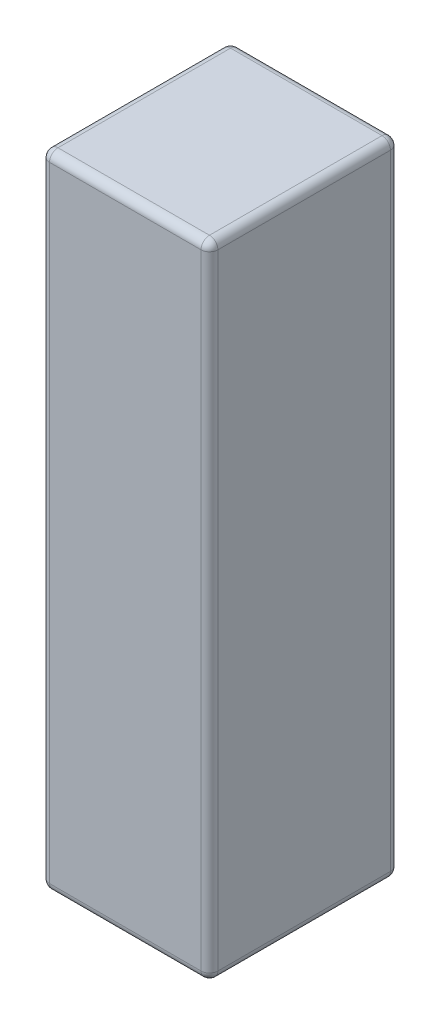
ISO-10303-21;
HEADER;
FILE_DESCRIPTION(('STEP AP214'),'2;1');
FILE_NAME('part.step','',(''),(''),'','','');
FILE_SCHEMA(('AUTOMOTIVE_DESIGN { 1 0 10303 214 1 1 1 1 }'));
ENDSEC;
DATA;
#1=APPLICATION_CONTEXT('core data for automotive mechanical design processes');
#2=APPLICATION_PROTOCOL_DEFINITION('international standard','automotive_design',2000,#1);
#3=PRODUCT_CONTEXT('',#1,'mechanical');
#4=PRODUCT('Part','Part','',(#3));
#5=PRODUCT_RELATED_PRODUCT_CATEGORY('part','',(#4));
#6=PRODUCT_DEFINITION_FORMATION('','',#4);
#7=PRODUCT_DEFINITION_CONTEXT('part definition',#1,'design');
#8=PRODUCT_DEFINITION('design','',#6,#7);
#9=PRODUCT_DEFINITION_SHAPE('','',#8);
#10=(LENGTH_UNIT() NAMED_UNIT(*) SI_UNIT(.MILLI.,.METRE.));
#11=(NAMED_UNIT(*) PLANE_ANGLE_UNIT() SI_UNIT($,.RADIAN.));
#12=(NAMED_UNIT(*) SI_UNIT($,.STERADIAN.) SOLID_ANGLE_UNIT());
#13=UNCERTAINTY_MEASURE_WITH_UNIT(LENGTH_MEASURE(1.E-05),#10,'distance_accuracy_value','');
#14=(GEOMETRIC_REPRESENTATION_CONTEXT(3) GLOBAL_UNCERTAINTY_ASSIGNED_CONTEXT((#13)) GLOBAL_UNIT_ASSIGNED_CONTEXT((#10,
#11,#12)) REPRESENTATION_CONTEXT('',''));
#15=CARTESIAN_POINT('',(0.,0.,0.));
#16=DIRECTION('',(0.,0.,1.));
#17=DIRECTION('',(1.,0.,0.));
#18=AXIS2_PLACEMENT_3D('',#15,#16,#17);
#19=CARTESIAN_POINT('',(-20.,152.4,-22.5));
#20=DIRECTION('',(1.,0.,0.));
#21=DIRECTION('',(0.,0.,-1.));
#22=AXIS2_PLACEMENT_3D('',#19,#20,#21);
#23=PLANE('',#22);
#24=DIRECTION('',(0.,-1.,0.));
#25=VECTOR('',#24,1.);
#26=CARTESIAN_POINT('',(-20.,152.4,-20.5));
#27=LINE('',#26,#25);
#28=CARTESIAN_POINT('',(-20.,150.4,-20.5));
#29=VERTEX_POINT('',#28);
#30=CARTESIAN_POINT('',(-20.,2.,-20.5));
#31=VERTEX_POINT('',#30);
#32=EDGE_CURVE('E166',#29,#31,#27,.T.);
#33=ORIENTED_EDGE('',*,*,#32,.T.);
#34=DIRECTION('',(0.,0.,1.));
#35=VECTOR('',#34,1.);
#36=CARTESIAN_POINT('',(-20.,2.,22.5));
#37=LINE('',#36,#35);
#38=CARTESIAN_POINT('',(-20.,2.,20.5));
#39=VERTEX_POINT('',#38);
#40=EDGE_CURVE('E139',#31,#39,#37,.T.);
#41=ORIENTED_EDGE('',*,*,#40,.T.);
#42=DIRECTION('',(0.,-1.,0.));
#43=VECTOR('',#42,1.);
#44=CARTESIAN_POINT('',(-20.,152.4,20.5));
#45=LINE('',#44,#43);
#46=CARTESIAN_POINT('',(-20.,150.4,20.5));
#47=VERTEX_POINT('',#46);
#48=EDGE_CURVE('E157',#39,#47,#45,.F.);
#49=ORIENTED_EDGE('',*,*,#48,.T.);
#50=DIRECTION('',(0.,0.,1.));
#51=VECTOR('',#50,1.);
#52=CARTESIAN_POINT('',(-20.,150.4,-22.5));
#53=LINE('',#52,#51);
#54=EDGE_CURVE('E163',#47,#29,#53,.F.);
#55=ORIENTED_EDGE('',*,*,#54,.T.);
#56=EDGE_LOOP('',(#33,#41,#49,#55));
#57=FACE_BOUND('',#56,.T.);
#58=ADVANCED_FACE('F45',(#57),#23,.F.);
#59=CARTESIAN_POINT('',(20.,152.4,22.5));
#60=DIRECTION('',(0.,0.,-1.));
#61=DIRECTION('',(-1.,0.,0.));
#62=AXIS2_PLACEMENT_3D('',#59,#60,#61);
#63=PLANE('',#62);
#64=DIRECTION('',(1.,0.,0.));
#65=VECTOR('',#64,1.);
#66=CARTESIAN_POINT('',(20.,150.4,22.5));
#67=LINE('',#66,#65);
#68=CARTESIAN_POINT('',(18.,150.4,22.5));
#69=VERTEX_POINT('',#68);
#70=CARTESIAN_POINT('',(-18.,150.4,22.5));
#71=VERTEX_POINT('',#70);
#72=EDGE_CURVE('E54',#69,#71,#67,.F.);
#73=ORIENTED_EDGE('',*,*,#72,.T.);
#74=DIRECTION('',(0.,-1.,0.));
#75=VECTOR('',#74,1.);
#76=CARTESIAN_POINT('',(-18.,152.4,22.5));
#77=LINE('',#76,#75);
#78=CARTESIAN_POINT('',(-18.,2.,22.5));
#79=VERTEX_POINT('',#78);
#80=EDGE_CURVE('E11',#71,#79,#77,.T.);
#81=ORIENTED_EDGE('',*,*,#80,.T.);
#82=DIRECTION('',(1.,0.,0.));
#83=VECTOR('',#82,1.);
#84=CARTESIAN_POINT('',(20.,2.,22.5));
#85=LINE('',#84,#83);
#86=CARTESIAN_POINT('',(18.,2.,22.5));
#87=VERTEX_POINT('',#86);
#88=EDGE_CURVE('E206',#79,#87,#85,.T.);
#89=ORIENTED_EDGE('',*,*,#88,.T.);
#90=DIRECTION('',(0.,-1.,0.));
#91=VECTOR('',#90,1.);
#92=CARTESIAN_POINT('',(18.,152.4,22.5));
#93=LINE('',#92,#91);
#94=EDGE_CURVE('E65',#87,#69,#93,.F.);
#95=ORIENTED_EDGE('',*,*,#94,.T.);
#96=EDGE_LOOP('',(#73,#81,#89,#95));
#97=FACE_BOUND('',#96,.T.);
#98=ADVANCED_FACE('F321',(#97),#63,.F.);
#99=CARTESIAN_POINT('',(20.,152.4,-22.5));
#100=DIRECTION('',(-1.,0.,0.));
#101=DIRECTION('',(0.,0.,1.));
#102=AXIS2_PLACEMENT_3D('',#99,#100,#101);
#103=PLANE('',#102);
#104=DIRECTION('',(0.,0.,-1.));
#105=VECTOR('',#104,1.);
#106=CARTESIAN_POINT('',(20.,2.,-22.5));
#107=LINE('',#106,#105);
#108=CARTESIAN_POINT('',(20.,2.,20.5));
#109=VERTEX_POINT('',#108);
#110=CARTESIAN_POINT('',(20.,2.,-20.5));
#111=VERTEX_POINT('',#110);
#112=EDGE_CURVE('E192',#109,#111,#107,.T.);
#113=ORIENTED_EDGE('',*,*,#112,.T.);
#114=DIRECTION('',(0.,-1.,0.));
#115=VECTOR('',#114,1.);
#116=CARTESIAN_POINT('',(20.,152.4,-20.5));
#117=LINE('',#116,#115);
#118=CARTESIAN_POINT('',(20.,150.4,-20.5));
#119=VERTEX_POINT('',#118);
#120=EDGE_CURVE('E194',#111,#119,#117,.F.);
#121=ORIENTED_EDGE('',*,*,#120,.T.);
#122=DIRECTION('',(0.,0.,-1.));
#123=VECTOR('',#122,1.);
#124=CARTESIAN_POINT('',(20.,150.4,-22.5));
#125=LINE('',#124,#123);
#126=CARTESIAN_POINT('',(20.,150.4,20.5));
#127=VERTEX_POINT('',#126);
#128=EDGE_CURVE('E190',#119,#127,#125,.F.);
#129=ORIENTED_EDGE('',*,*,#128,.T.);
#130=DIRECTION('',(0.,-1.,0.));
#131=VECTOR('',#130,1.);
#132=CARTESIAN_POINT('',(20.,152.4,20.5));
#133=LINE('',#132,#131);
#134=EDGE_CURVE('E188',#127,#109,#133,.T.);
#135=ORIENTED_EDGE('',*,*,#134,.T.);
#136=EDGE_LOOP('',(#113,#121,#129,#135));
#137=FACE_BOUND('',#136,.T.);
#138=ADVANCED_FACE('F277',(#137),#103,.F.);
#139=CARTESIAN_POINT('',(20.,152.4,-22.5));
#140=DIRECTION('',(0.,0.,1.));
#141=DIRECTION('',(1.,0.,0.));
#142=AXIS2_PLACEMENT_3D('',#139,#140,#141);
#143=PLANE('',#142);
#144=DIRECTION('',(-1.,0.,0.));
#145=VECTOR('',#144,1.);
#146=CARTESIAN_POINT('',(-20.,2.,-22.5));
#147=LINE('',#146,#145);
#148=CARTESIAN_POINT('',(18.,2.,-22.5));
#149=VERTEX_POINT('',#148);
#150=CARTESIAN_POINT('',(-18.,2.,-22.5));
#151=VERTEX_POINT('',#150);
#152=EDGE_CURVE('E183',#149,#151,#147,.T.);
#153=ORIENTED_EDGE('',*,*,#152,.T.);
#154=DIRECTION('',(0.,-1.,0.));
#155=VECTOR('',#154,1.);
#156=CARTESIAN_POINT('',(-18.,152.4,-22.5));
#157=LINE('',#156,#155);
#158=CARTESIAN_POINT('',(-18.,150.4,-22.5));
#159=VERTEX_POINT('',#158);
#160=EDGE_CURVE('E185',#151,#159,#157,.F.);
#161=ORIENTED_EDGE('',*,*,#160,.T.);
#162=DIRECTION('',(-1.,0.,0.));
#163=VECTOR('',#162,1.);
#164=CARTESIAN_POINT('',(20.,150.4,-22.5));
#165=LINE('',#164,#163);
#166=CARTESIAN_POINT('',(18.,150.4,-22.5));
#167=VERTEX_POINT('',#166);
#168=EDGE_CURVE('E179',#159,#167,#165,.F.);
#169=ORIENTED_EDGE('',*,*,#168,.T.);
#170=DIRECTION('',(0.,-1.,0.));
#171=VECTOR('',#170,1.);
#172=CARTESIAN_POINT('',(18.,152.4,-22.5));
#173=LINE('',#172,#171);
#174=EDGE_CURVE('E181',#167,#149,#173,.T.);
#175=ORIENTED_EDGE('',*,*,#174,.T.);
#176=EDGE_LOOP('',(#153,#161,#169,#175));
#177=FACE_BOUND('',#176,.T.);
#178=ADVANCED_FACE('F298',(#177),#143,.F.);
#179=CARTESIAN_POINT('',(0.,152.4,0.));
#180=DIRECTION('',(0.,-1.,0.));
#181=DIRECTION('',(0.,0.,-1.));
#182=AXIS2_PLACEMENT_3D('',#179,#180,#181);
#183=PLANE('',#182);
#184=DIRECTION('',(0.,0.,-1.));
#185=VECTOR('',#184,1.);
#186=CARTESIAN_POINT('',(18.,152.4,0.));
#187=LINE('',#186,#185);
#188=CARTESIAN_POINT('',(18.,152.4,20.5));
#189=VERTEX_POINT('',#188);
#190=CARTESIAN_POINT('',(18.,152.4,-20.5));
#191=VERTEX_POINT('',#190);
#192=EDGE_CURVE('E201',#189,#191,#187,.T.);
#193=ORIENTED_EDGE('',*,*,#192,.T.);
#194=DIRECTION('',(-1.,0.,0.));
#195=VECTOR('',#194,1.);
#196=CARTESIAN_POINT('',(0.,152.4,-20.5));
#197=LINE('',#196,#195);
#198=CARTESIAN_POINT('',(-18.,152.4,-20.5));
#199=VERTEX_POINT('',#198);
#200=EDGE_CURVE('E203',#191,#199,#197,.T.);
#201=ORIENTED_EDGE('',*,*,#200,.T.);
#202=DIRECTION('',(0.,0.,1.));
#203=VECTOR('',#202,1.);
#204=CARTESIAN_POINT('',(-18.,152.4,0.));
#205=LINE('',#204,#203);
#206=CARTESIAN_POINT('',(-18.,152.4,20.5));
#207=VERTEX_POINT('',#206);
#208=EDGE_CURVE('E199',#199,#207,#205,.T.);
#209=ORIENTED_EDGE('',*,*,#208,.T.);
#210=DIRECTION('',(1.,0.,0.));
#211=VECTOR('',#210,1.);
#212=CARTESIAN_POINT('',(0.,152.4,20.5));
#213=LINE('',#212,#211);
#214=EDGE_CURVE('E197',#207,#189,#213,.T.);
#215=ORIENTED_EDGE('',*,*,#214,.T.);
#216=EDGE_LOOP('',(#193,#201,#209,#215));
#217=FACE_BOUND('',#216,.T.);
#218=ADVANCED_FACE('F312',(#217),#183,.F.);
#219=CARTESIAN_POINT('',(0.,0.,0.));
#220=DIRECTION('',(0.,-1.,0.));
#221=DIRECTION('',(0.,0.,-1.));
#222=AXIS2_PLACEMENT_3D('',#219,#220,#221);
#223=PLANE('',#222);
#224=DIRECTION('',(1.,0.,0.));
#225=VECTOR('',#224,1.);
#226=CARTESIAN_POINT('',(-20.,0.,20.5));
#227=LINE('',#226,#225);
#228=CARTESIAN_POINT('',(18.,0.,20.5));
#229=VERTEX_POINT('',#228);
#230=CARTESIAN_POINT('',(-18.,0.,20.5));
#231=VERTEX_POINT('',#230);
#232=EDGE_CURVE('E168',#229,#231,#227,.F.);
#233=ORIENTED_EDGE('',*,*,#232,.T.);
#234=DIRECTION('',(0.,0.,1.));
#235=VECTOR('',#234,1.);
#236=CARTESIAN_POINT('',(-18.,0.,-22.5));
#237=LINE('',#236,#235);
#238=CARTESIAN_POINT('',(-18.,0.,-20.5));
#239=VERTEX_POINT('',#238);
#240=EDGE_CURVE('E141',#231,#239,#237,.F.);
#241=ORIENTED_EDGE('',*,*,#240,.T.);
#242=DIRECTION('',(-1.,0.,0.));
#243=VECTOR('',#242,1.);
#244=CARTESIAN_POINT('',(20.,0.,-20.5));
#245=LINE('',#244,#243);
#246=CARTESIAN_POINT('',(18.,0.,-20.5));
#247=VERTEX_POINT('',#246);
#248=EDGE_CURVE('E176',#239,#247,#245,.F.);
#249=ORIENTED_EDGE('',*,*,#248,.T.);
#250=DIRECTION('',(0.,0.,-1.));
#251=VECTOR('',#250,1.);
#252=CARTESIAN_POINT('',(18.,0.,22.5));
#253=LINE('',#252,#251);
#254=EDGE_CURVE('E170',#247,#229,#253,.F.);
#255=ORIENTED_EDGE('',*,*,#254,.T.);
#256=EDGE_LOOP('',(#233,#241,#249,#255));
#257=FACE_BOUND('',#256,.T.);
#258=ADVANCED_FACE('F332',(#257),#223,.T.);
#259=CARTESIAN_POINT('',(18.,150.4,0.));
#260=DIRECTION('',(0.,0.,-1.));
#261=DIRECTION('',(-1.,0.,0.));
#262=AXIS2_PLACEMENT_3D('',#259,#260,#261);
#263=CYLINDRICAL_SURFACE('',#262,2.);
#264=CARTESIAN_POINT('',(18.,150.4,-20.5));
#265=DIRECTION('',(0.,0.,-1.));
#266=DIRECTION('',(-1.,0.,0.));
#267=AXIS2_PLACEMENT_3D('',#264,#265,#266);
#268=CIRCLE('',#267,2.);
#269=EDGE_CURVE('E49',#191,#119,#268,.T.);
#270=ORIENTED_EDGE('',*,*,#269,.F.);
#271=ORIENTED_EDGE('',*,*,#192,.F.);
#272=CARTESIAN_POINT('',(18.,150.4,20.5));
#273=DIRECTION('',(0.,0.,1.));
#274=DIRECTION('',(0.,-1.,0.));
#275=AXIS2_PLACEMENT_3D('',#272,#273,#274);
#276=CIRCLE('',#275,2.);
#277=EDGE_CURVE('E258',#127,#189,#276,.T.);
#278=ORIENTED_EDGE('',*,*,#277,.F.);
#279=ORIENTED_EDGE('',*,*,#128,.F.);
#280=EDGE_LOOP('',(#270,#271,#278,#279));
#281=FACE_BOUND('',#280,.T.);
#282=ADVANCED_FACE('F47',(#281),#263,.T.);
#283=CARTESIAN_POINT('',(18.,150.4,-20.5));
#284=DIRECTION('',(1.,0.,0.));
#285=DIRECTION('',(0.,0.,-1.));
#286=AXIS2_PLACEMENT_3D('',#283,#284,#285);
#287=SPHERICAL_SURFACE('',#286,2.);
#288=CARTESIAN_POINT('',(18.,150.4,-20.5));
#289=DIRECTION('',(1.,0.,0.));
#290=DIRECTION('',(0.,0.,-1.));
#291=AXIS2_PLACEMENT_3D('',#288,#289,#290);
#292=CIRCLE('',#291,2.);
#293=EDGE_CURVE('E254',#191,#167,#292,.F.);
#294=ORIENTED_EDGE('',*,*,#293,.F.);
#295=ORIENTED_EDGE('',*,*,#269,.T.);
#296=CARTESIAN_POINT('',(18.,150.4,-20.5));
#297=DIRECTION('',(0.,1.,0.));
#298=DIRECTION('',(0.,0.,1.));
#299=AXIS2_PLACEMENT_3D('',#296,#297,#298);
#300=CIRCLE('',#299,2.);
#301=EDGE_CURVE('E257',#167,#119,#300,.F.);
#302=ORIENTED_EDGE('',*,*,#301,.F.);
#303=EDGE_LOOP('',(#294,#295,#302));
#304=FACE_BOUND('',#303,.T.);
#305=ADVANCED_FACE('F270',(#304),#287,.T.);
#306=CARTESIAN_POINT('',(18.,150.4,20.5));
#307=DIRECTION('',(0.,1.,0.));
#308=DIRECTION('',(0.,0.,1.));
#309=AXIS2_PLACEMENT_3D('',#306,#307,#308);
#310=SPHERICAL_SURFACE('',#309,2.);
#311=CARTESIAN_POINT('',(18.,150.4,20.5));
#312=DIRECTION('',(0.,1.,0.));
#313=DIRECTION('',(0.,0.,1.));
#314=AXIS2_PLACEMENT_3D('',#311,#312,#313);
#315=CIRCLE('',#314,2.);
#316=EDGE_CURVE('E249',#127,#69,#315,.F.);
#317=ORIENTED_EDGE('',*,*,#316,.F.);
#318=ORIENTED_EDGE('',*,*,#277,.T.);
#319=CARTESIAN_POINT('',(18.,150.4,20.5));
#320=DIRECTION('',(1.,0.,0.));
#321=DIRECTION('',(0.,0.,-1.));
#322=AXIS2_PLACEMENT_3D('',#319,#320,#321);
#323=CIRCLE('',#322,2.);
#324=EDGE_CURVE('E251',#69,#189,#323,.F.);
#325=ORIENTED_EDGE('',*,*,#324,.F.);
#326=EDGE_LOOP('',(#317,#318,#325));
#327=FACE_BOUND('',#326,.T.);
#328=ADVANCED_FACE('F385',(#327),#310,.T.);
#329=CARTESIAN_POINT('',(18.,152.4,-20.5));
#330=DIRECTION('',(0.,-1.,0.));
#331=DIRECTION('',(0.,0.,-1.));
#332=AXIS2_PLACEMENT_3D('',#329,#330,#331);
#333=CYLINDRICAL_SURFACE('',#332,2.);
#334=ORIENTED_EDGE('',*,*,#301,.T.);
#335=ORIENTED_EDGE('',*,*,#120,.F.);
#336=CARTESIAN_POINT('',(18.,2.,-20.5));
#337=DIRECTION('',(0.,-1.,0.));
#338=DIRECTION('',(0.,0.,-1.));
#339=AXIS2_PLACEMENT_3D('',#336,#337,#338);
#340=CIRCLE('',#339,2.);
#341=EDGE_CURVE('E243',#149,#111,#340,.T.);
#342=ORIENTED_EDGE('',*,*,#341,.F.);
#343=ORIENTED_EDGE('',*,*,#174,.F.);
#344=EDGE_LOOP('',(#334,#335,#342,#343));
#345=FACE_BOUND('',#344,.T.);
#346=ADVANCED_FACE('F282',(#345),#333,.T.);
#347=CARTESIAN_POINT('',(0.,150.4,-20.5));
#348=DIRECTION('',(-1.,0.,0.));
#349=DIRECTION('',(0.,0.,1.));
#350=AXIS2_PLACEMENT_3D('',#347,#348,#349);
#351=CYLINDRICAL_SURFACE('',#350,2.);
#352=ORIENTED_EDGE('',*,*,#293,.T.);
#353=ORIENTED_EDGE('',*,*,#168,.F.);
#354=CARTESIAN_POINT('',(-18.,150.4,-20.5));
#355=DIRECTION('',(-1.,0.,0.));
#356=DIRECTION('',(0.,0.,1.));
#357=AXIS2_PLACEMENT_3D('',#354,#355,#356);
#358=CIRCLE('',#357,2.);
#359=EDGE_CURVE('E240',#199,#159,#358,.T.);
#360=ORIENTED_EDGE('',*,*,#359,.F.);
#361=ORIENTED_EDGE('',*,*,#200,.F.);
#362=EDGE_LOOP('',(#352,#353,#360,#361));
#363=FACE_BOUND('',#362,.T.);
#364=ADVANCED_FACE('F310',(#363),#351,.T.);
#365=CARTESIAN_POINT('',(-18.,150.4,0.));
#366=DIRECTION('',(0.,0.,1.));
#367=DIRECTION('',(1.,0.,0.));
#368=AXIS2_PLACEMENT_3D('',#365,#366,#367);
#369=CYLINDRICAL_SURFACE('',#368,2.);
#370=CARTESIAN_POINT('',(-18.,150.4,20.5));
#371=DIRECTION('',(0.,0.,1.));
#372=DIRECTION('',(1.,0.,0.));
#373=AXIS2_PLACEMENT_3D('',#370,#371,#372);
#374=CIRCLE('',#373,2.);
#375=EDGE_CURVE('E235',#207,#47,#374,.T.);
#376=ORIENTED_EDGE('',*,*,#375,.F.);
#377=ORIENTED_EDGE('',*,*,#208,.F.);
#378=CARTESIAN_POINT('',(-18.,150.4,-20.5));
#379=DIRECTION('',(0.,0.,-1.));
#380=DIRECTION('',(-1.,0.,0.));
#381=AXIS2_PLACEMENT_3D('',#378,#379,#380);
#382=CIRCLE('',#381,2.);
#383=EDGE_CURVE('E238',#29,#199,#382,.T.);
#384=ORIENTED_EDGE('',*,*,#383,.F.);
#385=ORIENTED_EDGE('',*,*,#54,.F.);
#386=EDGE_LOOP('',(#376,#377,#384,#385));
#387=FACE_BOUND('',#386,.T.);
#388=ADVANCED_FACE('F318',(#387),#369,.T.);
#389=CARTESIAN_POINT('',(0.,150.4,20.5));
#390=DIRECTION('',(1.,0.,0.));
#391=DIRECTION('',(0.,0.,-1.));
#392=AXIS2_PLACEMENT_3D('',#389,#390,#391);
#393=CYLINDRICAL_SURFACE('',#392,2.);
#394=ORIENTED_EDGE('',*,*,#324,.T.);
#395=ORIENTED_EDGE('',*,*,#214,.F.);
#396=CARTESIAN_POINT('',(-18.,150.4,20.5));
#397=DIRECTION('',(-1.,0.,0.));
#398=DIRECTION('',(0.,-1.,0.));
#399=AXIS2_PLACEMENT_3D('',#396,#397,#398);
#400=CIRCLE('',#399,2.);
#401=EDGE_CURVE('E232',#71,#207,#400,.T.);
#402=ORIENTED_EDGE('',*,*,#401,.F.);
#403=ORIENTED_EDGE('',*,*,#72,.F.);
#404=EDGE_LOOP('',(#394,#395,#402,#403));
#405=FACE_BOUND('',#404,.T.);
#406=ADVANCED_FACE('F316',(#405),#393,.T.);
#407=CARTESIAN_POINT('',(18.,152.4,20.5));
#408=DIRECTION('',(0.,-1.,0.));
#409=DIRECTION('',(0.,0.,-1.));
#410=AXIS2_PLACEMENT_3D('',#407,#408,#409);
#411=CYLINDRICAL_SURFACE('',#410,2.);
#412=ORIENTED_EDGE('',*,*,#316,.T.);
#413=ORIENTED_EDGE('',*,*,#94,.F.);
#414=CARTESIAN_POINT('',(18.,2.,20.5));
#415=DIRECTION('',(0.,-1.,0.));
#416=DIRECTION('',(0.,0.,-1.));
#417=AXIS2_PLACEMENT_3D('',#414,#415,#416);
#418=CIRCLE('',#417,2.);
#419=EDGE_CURVE('E229',#109,#87,#418,.T.);
#420=ORIENTED_EDGE('',*,*,#419,.F.);
#421=ORIENTED_EDGE('',*,*,#134,.F.);
#422=EDGE_LOOP('',(#412,#413,#420,#421));
#423=FACE_BOUND('',#422,.T.);
#424=ADVANCED_FACE('F324',(#423),#411,.T.);
#425=CARTESIAN_POINT('',(18.,2.,-22.5));
#426=DIRECTION('',(0.,0.,1.));
#427=DIRECTION('',(1.,0.,0.));
#428=AXIS2_PLACEMENT_3D('',#425,#426,#427);
#429=CYLINDRICAL_SURFACE('',#428,2.);
#430=CARTESIAN_POINT('',(18.,2.,-20.5));
#431=DIRECTION('',(0.,0.,-1.));
#432=DIRECTION('',(-1.,0.,0.));
#433=AXIS2_PLACEMENT_3D('',#430,#431,#432);
#434=CIRCLE('',#433,2.);
#435=EDGE_CURVE('E246',#111,#247,#434,.T.);
#436=ORIENTED_EDGE('',*,*,#435,.F.);
#437=ORIENTED_EDGE('',*,*,#112,.F.);
#438=CARTESIAN_POINT('',(18.,2.,20.5));
#439=DIRECTION('',(0.,0.,1.));
#440=DIRECTION('',(1.,0.,0.));
#441=AXIS2_PLACEMENT_3D('',#438,#439,#440);
#442=CIRCLE('',#441,2.);
#443=EDGE_CURVE('E226',#229,#109,#442,.T.);
#444=ORIENTED_EDGE('',*,*,#443,.F.);
#445=ORIENTED_EDGE('',*,*,#254,.F.);
#446=EDGE_LOOP('',(#436,#437,#444,#445));
#447=FACE_BOUND('',#446,.T.);
#448=ADVANCED_FACE('F286',(#447),#429,.T.);
#449=CARTESIAN_POINT('',(18.,2.,-20.5));
#450=DIRECTION('',(1.,0.,0.));
#451=DIRECTION('',(0.,1.,0.));
#452=AXIS2_PLACEMENT_3D('',#449,#450,#451);
#453=SPHERICAL_SURFACE('',#452,2.);
#454=ORIENTED_EDGE('',*,*,#341,.T.);
#455=ORIENTED_EDGE('',*,*,#435,.T.);
#456=CARTESIAN_POINT('',(18.,2.,-20.5));
#457=DIRECTION('',(1.,0.,0.));
#458=DIRECTION('',(0.,0.,-1.));
#459=AXIS2_PLACEMENT_3D('',#456,#457,#458);
#460=CIRCLE('',#459,2.);
#461=EDGE_CURVE('E223',#149,#247,#460,.F.);
#462=ORIENTED_EDGE('',*,*,#461,.F.);
#463=EDGE_LOOP('',(#454,#455,#462));
#464=FACE_BOUND('',#463,.T.);
#465=ADVANCED_FACE('F290',(#464),#453,.T.);
#466=CARTESIAN_POINT('',(-18.,150.4,-20.5));
#467=DIRECTION('',(0.,1.,0.));
#468=DIRECTION('',(0.,0.,1.));
#469=AXIS2_PLACEMENT_3D('',#466,#467,#468);
#470=SPHERICAL_SURFACE('',#469,2.);
#471=ORIENTED_EDGE('',*,*,#383,.T.);
#472=ORIENTED_EDGE('',*,*,#359,.T.);
#473=CARTESIAN_POINT('',(-18.,150.4,-20.5));
#474=DIRECTION('',(0.,1.,0.));
#475=DIRECTION('',(0.,0.,1.));
#476=AXIS2_PLACEMENT_3D('',#473,#474,#475);
#477=CIRCLE('',#476,2.);
#478=EDGE_CURVE('E221',#29,#159,#477,.F.);
#479=ORIENTED_EDGE('',*,*,#478,.F.);
#480=EDGE_LOOP('',(#471,#472,#479));
#481=FACE_BOUND('',#480,.T.);
#482=ADVANCED_FACE('F306',(#481),#470,.T.);
#483=CARTESIAN_POINT('',(-18.,150.4,20.5));
#484=DIRECTION('',(0.,1.,0.));
#485=DIRECTION('',(0.,0.,1.));
#486=AXIS2_PLACEMENT_3D('',#483,#484,#485);
#487=SPHERICAL_SURFACE('',#486,2.);
#488=ORIENTED_EDGE('',*,*,#401,.T.);
#489=ORIENTED_EDGE('',*,*,#375,.T.);
#490=CARTESIAN_POINT('',(-18.,150.4,20.5));
#491=DIRECTION('',(0.,1.,0.));
#492=DIRECTION('',(0.,0.,1.));
#493=AXIS2_PLACEMENT_3D('',#490,#491,#492);
#494=CIRCLE('',#493,2.);
#495=EDGE_CURVE('E160',#71,#47,#494,.F.);
#496=ORIENTED_EDGE('',*,*,#495,.F.);
#497=EDGE_LOOP('',(#488,#489,#496));
#498=FACE_BOUND('',#497,.T.);
#499=ADVANCED_FACE('F320',(#498),#487,.T.);
#500=CARTESIAN_POINT('',(18.,2.,20.5));
#501=DIRECTION('',(1.,0.,0.));
#502=DIRECTION('',(0.,0.,-1.));
#503=AXIS2_PLACEMENT_3D('',#500,#501,#502);
#504=SPHERICAL_SURFACE('',#503,2.);
#505=ORIENTED_EDGE('',*,*,#443,.T.);
#506=ORIENTED_EDGE('',*,*,#419,.T.);
#507=CARTESIAN_POINT('',(18.,2.,20.5));
#508=DIRECTION('',(1.,0.,0.));
#509=DIRECTION('',(0.,0.,-1.));
#510=AXIS2_PLACEMENT_3D('',#507,#508,#509);
#511=CIRCLE('',#510,2.);
#512=EDGE_CURVE('E217',#229,#87,#511,.F.);
#513=ORIENTED_EDGE('',*,*,#512,.F.);
#514=EDGE_LOOP('',(#505,#506,#513));
#515=FACE_BOUND('',#514,.T.);
#516=ADVANCED_FACE('F328',(#515),#504,.T.);
#517=CARTESIAN_POINT('',(20.,2.,-20.5));
#518=DIRECTION('',(1.,0.,0.));
#519=DIRECTION('',(0.,0.,-1.));
#520=AXIS2_PLACEMENT_3D('',#517,#518,#519);
#521=CYLINDRICAL_SURFACE('',#520,2.);
#522=ORIENTED_EDGE('',*,*,#461,.T.);
#523=ORIENTED_EDGE('',*,*,#248,.F.);
#524=CARTESIAN_POINT('',(-18.,2.,-20.5));
#525=DIRECTION('',(-1.,0.,0.));
#526=DIRECTION('',(0.,0.,1.));
#527=AXIS2_PLACEMENT_3D('',#524,#525,#526);
#528=CIRCLE('',#527,2.);
#529=EDGE_CURVE('E214',#151,#239,#528,.T.);
#530=ORIENTED_EDGE('',*,*,#529,.F.);
#531=ORIENTED_EDGE('',*,*,#152,.F.);
#532=EDGE_LOOP('',(#522,#523,#530,#531));
#533=FACE_BOUND('',#532,.T.);
#534=ADVANCED_FACE('F295',(#533),#521,.T.);
#535=CARTESIAN_POINT('',(-18.,152.4,-20.5));
#536=DIRECTION('',(0.,-1.,0.));
#537=DIRECTION('',(0.,0.,-1.));
#538=AXIS2_PLACEMENT_3D('',#535,#536,#537);
#539=CYLINDRICAL_SURFACE('',#538,2.);
#540=ORIENTED_EDGE('',*,*,#478,.T.);
#541=ORIENTED_EDGE('',*,*,#160,.F.);
#542=CARTESIAN_POINT('',(-18.,2.,-20.5));
#543=DIRECTION('',(0.,-1.,0.));
#544=DIRECTION('',(0.,0.,-1.));
#545=AXIS2_PLACEMENT_3D('',#542,#543,#544);
#546=CIRCLE('',#545,2.);
#547=EDGE_CURVE('E154',#31,#151,#546,.T.);
#548=ORIENTED_EDGE('',*,*,#547,.F.);
#549=ORIENTED_EDGE('',*,*,#32,.F.);
#550=EDGE_LOOP('',(#540,#541,#548,#549));
#551=FACE_BOUND('',#550,.T.);
#552=ADVANCED_FACE('F300',(#551),#539,.T.);
#553=CARTESIAN_POINT('',(-18.,152.4,20.5));
#554=DIRECTION('',(0.,-1.,0.));
#555=DIRECTION('',(0.,0.,-1.));
#556=AXIS2_PLACEMENT_3D('',#553,#554,#555);
#557=CYLINDRICAL_SURFACE('',#556,2.);
#558=ORIENTED_EDGE('',*,*,#495,.T.);
#559=ORIENTED_EDGE('',*,*,#48,.F.);
#560=CARTESIAN_POINT('',(-18.,2.,20.5));
#561=DIRECTION('',(0.,-1.,0.));
#562=DIRECTION('',(0.,0.,-1.));
#563=AXIS2_PLACEMENT_3D('',#560,#561,#562);
#564=CIRCLE('',#563,2.);
#565=EDGE_CURVE('E146',#79,#39,#564,.T.);
#566=ORIENTED_EDGE('',*,*,#565,.F.);
#567=ORIENTED_EDGE('',*,*,#80,.F.);
#568=EDGE_LOOP('',(#558,#559,#566,#567));
#569=FACE_BOUND('',#568,.T.);
#570=ADVANCED_FACE('F158',(#569),#557,.T.);
#571=CARTESIAN_POINT('',(20.,2.,20.5));
#572=DIRECTION('',(-1.,0.,0.));
#573=DIRECTION('',(0.,0.,1.));
#574=AXIS2_PLACEMENT_3D('',#571,#572,#573);
#575=CYLINDRICAL_SURFACE('',#574,2.);
#576=ORIENTED_EDGE('',*,*,#512,.T.);
#577=ORIENTED_EDGE('',*,*,#88,.F.);
#578=CARTESIAN_POINT('',(-18.,2.,20.5));
#579=DIRECTION('',(-1.,0.,0.));
#580=DIRECTION('',(0.,0.,1.));
#581=AXIS2_PLACEMENT_3D('',#578,#579,#580);
#582=CIRCLE('',#581,2.);
#583=EDGE_CURVE('E150',#231,#79,#582,.T.);
#584=ORIENTED_EDGE('',*,*,#583,.F.);
#585=ORIENTED_EDGE('',*,*,#232,.F.);
#586=EDGE_LOOP('',(#576,#577,#584,#585));
#587=FACE_BOUND('',#586,.T.);
#588=ADVANCED_FACE('F330',(#587),#575,.T.);
#589=CARTESIAN_POINT('',(-18.,2.,-20.5));
#590=DIRECTION('',(0.,0.,-1.));
#591=DIRECTION('',(0.,1.,0.));
#592=AXIS2_PLACEMENT_3D('',#589,#590,#591);
#593=SPHERICAL_SURFACE('',#592,2.);
#594=ORIENTED_EDGE('',*,*,#547,.T.);
#595=ORIENTED_EDGE('',*,*,#529,.T.);
#596=CARTESIAN_POINT('',(-18.,2.,-20.5));
#597=DIRECTION('',(0.,0.,-1.));
#598=DIRECTION('',(-1.,0.,0.));
#599=AXIS2_PLACEMENT_3D('',#596,#597,#598);
#600=CIRCLE('',#599,2.);
#601=EDGE_CURVE('E143',#31,#239,#600,.F.);
#602=ORIENTED_EDGE('',*,*,#601,.F.);
#603=EDGE_LOOP('',(#594,#595,#602));
#604=FACE_BOUND('',#603,.T.);
#605=ADVANCED_FACE('F353',(#604),#593,.T.);
#606=CARTESIAN_POINT('',(-18.,2.,20.5));
#607=DIRECTION('',(0.,0.,1.));
#608=DIRECTION('',(1.,0.,0.));
#609=AXIS2_PLACEMENT_3D('',#606,#607,#608);
#610=SPHERICAL_SURFACE('',#609,2.);
#611=ORIENTED_EDGE('',*,*,#583,.T.);
#612=ORIENTED_EDGE('',*,*,#565,.T.);
#613=CARTESIAN_POINT('',(-18.,2.,20.5));
#614=DIRECTION('',(0.,0.,1.));
#615=DIRECTION('',(1.,0.,0.));
#616=AXIS2_PLACEMENT_3D('',#613,#614,#615);
#617=CIRCLE('',#616,2.);
#618=EDGE_CURVE('E135',#231,#39,#617,.F.);
#619=ORIENTED_EDGE('',*,*,#618,.F.);
#620=EDGE_LOOP('',(#611,#612,#619));
#621=FACE_BOUND('',#620,.T.);
#622=ADVANCED_FACE('F148',(#621),#610,.T.);
#623=CARTESIAN_POINT('',(-18.,2.,-22.5));
#624=DIRECTION('',(0.,0.,-1.));
#625=DIRECTION('',(-1.,0.,0.));
#626=AXIS2_PLACEMENT_3D('',#623,#624,#625);
#627=CYLINDRICAL_SURFACE('',#626,2.);
#628=ORIENTED_EDGE('',*,*,#601,.T.);
#629=ORIENTED_EDGE('',*,*,#240,.F.);
#630=ORIENTED_EDGE('',*,*,#618,.T.);
#631=ORIENTED_EDGE('',*,*,#40,.F.);
#632=EDGE_LOOP('',(#628,#629,#630,#631));
#633=FACE_BOUND('',#632,.T.);
#634=ADVANCED_FACE('F137',(#633),#627,.T.);
#635=CLOSED_SHELL('',(#58,#98,#138,#178,#218,#258,#282,#305,#328,#346,#364,#388,#406,#424,#448,
#465,#482,#499,#516,#534,#552,#570,#588,#605,#622,#634));
#636=MANIFOLD_SOLID_BREP('B2',#635);
#637=ADVANCED_BREP_SHAPE_REPRESENTATION('',(#18,#636),#14);
#638=SHAPE_DEFINITION_REPRESENTATION(#9,#637);
ENDSEC;
END-ISO-10303-21;
